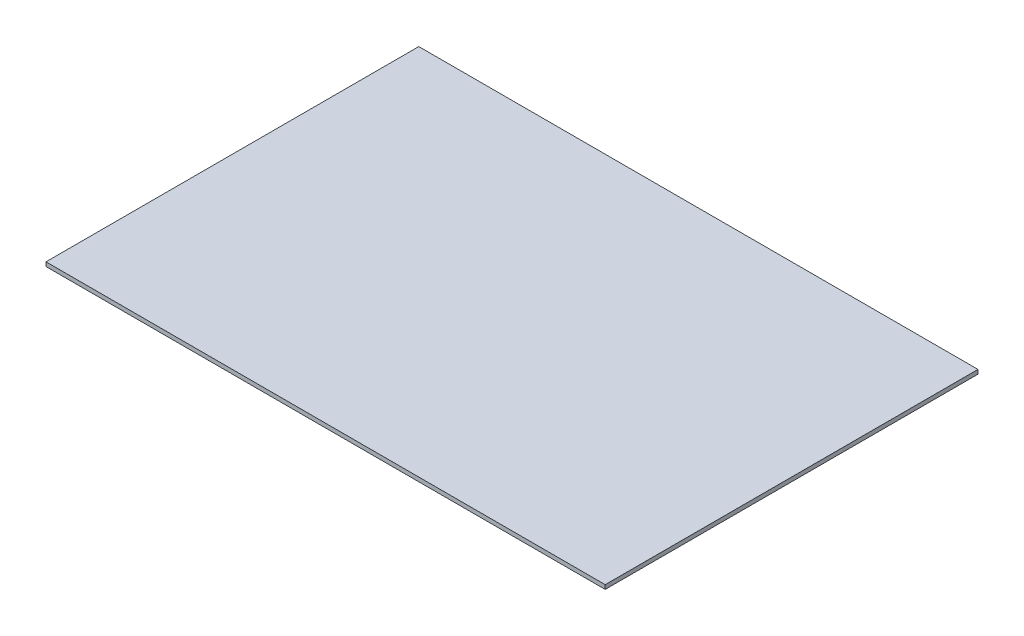
ISO-10303-21;
HEADER;
FILE_DESCRIPTION(('STEP AP214'),'2;1');
FILE_NAME('part.step','',(''),(''),'','','');
FILE_SCHEMA(('AUTOMOTIVE_DESIGN { 1 0 10303 214 1 1 1 1 }'));
ENDSEC;
DATA;
#1=APPLICATION_CONTEXT('core data for automotive mechanical design processes');
#2=APPLICATION_PROTOCOL_DEFINITION('international standard','automotive_design',2000,#1);
#3=PRODUCT_CONTEXT('',#1,'mechanical');
#4=PRODUCT('Part','Part','',(#3));
#5=PRODUCT_RELATED_PRODUCT_CATEGORY('part','',(#4));
#6=PRODUCT_DEFINITION_FORMATION('','',#4);
#7=PRODUCT_DEFINITION_CONTEXT('part definition',#1,'design');
#8=PRODUCT_DEFINITION('design','',#6,#7);
#9=PRODUCT_DEFINITION_SHAPE('','',#8);
#10=(LENGTH_UNIT() NAMED_UNIT(*) SI_UNIT(.MILLI.,.METRE.));
#11=(NAMED_UNIT(*) PLANE_ANGLE_UNIT() SI_UNIT($,.RADIAN.));
#12=(NAMED_UNIT(*) SI_UNIT($,.STERADIAN.) SOLID_ANGLE_UNIT());
#13=UNCERTAINTY_MEASURE_WITH_UNIT(LENGTH_MEASURE(1.E-05),#10,'distance_accuracy_value','');
#14=(GEOMETRIC_REPRESENTATION_CONTEXT(3) GLOBAL_UNCERTAINTY_ASSIGNED_CONTEXT((#13)) GLOBAL_UNIT_ASSIGNED_CONTEXT((#10,
#11,#12)) REPRESENTATION_CONTEXT('',''));
#15=CARTESIAN_POINT('',(0.,0.,0.));
#16=DIRECTION('',(0.,0.,1.));
#17=DIRECTION('',(1.,0.,0.));
#18=AXIS2_PLACEMENT_3D('',#15,#16,#17);
#19=CARTESIAN_POINT('',(3000.,-0.01,2000.01));
#20=DIRECTION('',(1.,0.,0.));
#21=DIRECTION('',(0.,0.,-1.));
#22=AXIS2_PLACEMENT_3D('',#19,#20,#21);
#23=PLANE('',#22);
#24=DIRECTION('',(0.,0.,-1.));
#25=VECTOR('',#24,1.);
#26=CARTESIAN_POINT('',(3000.,22.,1000.));
#27=LINE('',#26,#25);
#28=CARTESIAN_POINT('',(3000.,22.,2000.));
#29=VERTEX_POINT('',#28);
#30=CARTESIAN_POINT('',(3000.,22.,0.));
#31=VERTEX_POINT('',#30);
#32=EDGE_CURVE('P0_E68',#29,#31,#27,.T.);
#33=ORIENTED_EDGE('',*,*,#32,.F.);
#34=DIRECTION('',(0.,1.,0.));
#35=VECTOR('',#34,1.);
#36=CARTESIAN_POINT('',(3000.,11.,2000.));
#37=LINE('',#36,#35);
#38=CARTESIAN_POINT('',(3000.,0.,2000.));
#39=VERTEX_POINT('',#38);
#40=EDGE_CURVE('P0_E55',#39,#29,#37,.T.);
#41=ORIENTED_EDGE('',*,*,#40,.F.);
#42=DIRECTION('',(0.,0.,1.));
#43=VECTOR('',#42,1.);
#44=CARTESIAN_POINT('',(3000.,0.,1000.));
#45=LINE('',#44,#43);
#46=CARTESIAN_POINT('',(3000.,0.,-1.7713216520453E-13));
#47=VERTEX_POINT('',#46);
#48=EDGE_CURVE('P0_E20',#47,#39,#45,.T.);
#49=ORIENTED_EDGE('',*,*,#48,.F.);
#50=DIRECTION('',(0.,-1.,0.));
#51=VECTOR('',#50,1.);
#52=CARTESIAN_POINT('',(3000.,11.,0.));
#53=LINE('',#52,#51);
#54=EDGE_CURVE('P0_E81',#31,#47,#53,.T.);
#55=ORIENTED_EDGE('',*,*,#54,.F.);
#56=EDGE_LOOP('',(#33,#41,#49,#55));
#57=FACE_BOUND('',#56,.T.);
#58=ADVANCED_FACE('P0_F16',(#57),#23,.T.);
#59=CARTESIAN_POINT('',(3000.01,0.,2000.01));
#60=DIRECTION('',(0.,-1.,0.));
#61=DIRECTION('',(-1.,0.,0.));
#62=AXIS2_PLACEMENT_3D('',#59,#60,#61);
#63=PLANE('',#62);
#64=DIRECTION('',(-1.,0.,0.));
#65=VECTOR('',#64,1.);
#66=CARTESIAN_POINT('',(1500.,0.,0.));
#67=LINE('',#66,#65);
#68=CARTESIAN_POINT('',(-3.20824528442644E-13,0.,-1.64347685173384E-13));
#69=VERTEX_POINT('',#68);
#70=EDGE_CURVE('P0_E64',#47,#69,#67,.T.);
#71=ORIENTED_EDGE('',*,*,#70,.F.);
#72=ORIENTED_EDGE('',*,*,#48,.T.);
#73=DIRECTION('',(1.,0.,0.));
#74=VECTOR('',#73,1.);
#75=CARTESIAN_POINT('',(1500.,0.,2000.));
#76=LINE('',#75,#74);
#77=CARTESIAN_POINT('',(-2.74571447324875E-13,0.,2000.));
#78=VERTEX_POINT('',#77);
#79=EDGE_CURVE('P0_E61',#78,#39,#76,.T.);
#80=ORIENTED_EDGE('',*,*,#79,.F.);
#81=DIRECTION('',(0.,0.,1.));
#82=VECTOR('',#81,1.);
#83=CARTESIAN_POINT('',(0.,0.,1000.));
#84=LINE('',#83,#82);
#85=EDGE_CURVE('P0_E83',#69,#78,#84,.T.);
#86=ORIENTED_EDGE('',*,*,#85,.F.);
#87=EDGE_LOOP('',(#71,#72,#80,#86));
#88=FACE_BOUND('',#87,.T.);
#89=ADVANCED_FACE('P0_F60',(#88),#63,.T.);
#90=CARTESIAN_POINT('',(-0.01,-0.01,2000.));
#91=DIRECTION('',(0.,0.,1.));
#92=DIRECTION('',(1.,0.,0.));
#93=AXIS2_PLACEMENT_3D('',#90,#91,#92);
#94=PLANE('',#93);
#95=DIRECTION('',(1.,0.,0.));
#96=VECTOR('',#95,1.);
#97=CARTESIAN_POINT('',(1500.,22.,2000.));
#98=LINE('',#97,#96);
#99=CARTESIAN_POINT('',(-1.11017008506595E-13,22.,2000.));
#100=VERTEX_POINT('',#99);
#101=EDGE_CURVE('P0_E70',#100,#29,#98,.T.);
#102=ORIENTED_EDGE('',*,*,#101,.F.);
#103=DIRECTION('',(0.,1.,0.));
#104=VECTOR('',#103,1.);
#105=CARTESIAN_POINT('',(0.,11.,2000.));
#106=LINE('',#105,#104);
#107=EDGE_CURVE('P0_E74',#78,#100,#106,.T.);
#108=ORIENTED_EDGE('',*,*,#107,.F.);
#109=ORIENTED_EDGE('',*,*,#79,.T.);
#110=ORIENTED_EDGE('',*,*,#40,.T.);
#111=EDGE_LOOP('',(#102,#108,#109,#110));
#112=FACE_BOUND('',#111,.T.);
#113=ADVANCED_FACE('P0_F72',(#112),#94,.T.);
#114=CARTESIAN_POINT('',(-0.0100000000000477,22.,-0.0100000000000477));
#115=DIRECTION('',(0.,1.,0.));
#116=DIRECTION('',(0.,0.,1.));
#117=AXIS2_PLACEMENT_3D('',#114,#115,#116);
#118=PLANE('',#117);
#119=DIRECTION('',(1.,0.,0.));
#120=VECTOR('',#119,1.);
#121=CARTESIAN_POINT('',(1500.,22.,0.));
#122=LINE('',#121,#120);
#123=CARTESIAN_POINT('',(0.,22.,0.));
#124=VERTEX_POINT('',#123);
#125=EDGE_CURVE('P0_E35',#124,#31,#122,.T.);
#126=ORIENTED_EDGE('',*,*,#125,.F.);
#127=DIRECTION('',(0.,0.,-1.));
#128=VECTOR('',#127,1.);
#129=CARTESIAN_POINT('',(0.,22.,1000.));
#130=LINE('',#129,#128);
#131=EDGE_CURVE('P0_E26',#100,#124,#130,.T.);
#132=ORIENTED_EDGE('',*,*,#131,.F.);
#133=ORIENTED_EDGE('',*,*,#101,.T.);
#134=ORIENTED_EDGE('',*,*,#32,.T.);
#135=EDGE_LOOP('',(#126,#132,#133,#134));
#136=FACE_BOUND('',#135,.T.);
#137=ADVANCED_FACE('P0_F88',(#136),#118,.T.);
#138=CARTESIAN_POINT('',(3000.01,-0.01,0.));
#139=DIRECTION('',(0.,0.,-1.));
#140=DIRECTION('',(-1.,0.,0.));
#141=AXIS2_PLACEMENT_3D('',#138,#139,#140);
#142=PLANE('',#141);
#143=ORIENTED_EDGE('',*,*,#125,.T.);
#144=ORIENTED_EDGE('',*,*,#54,.T.);
#145=ORIENTED_EDGE('',*,*,#70,.T.);
#146=DIRECTION('',(0.,-1.,0.));
#147=VECTOR('',#146,1.);
#148=CARTESIAN_POINT('',(0.,11.,0.));
#149=LINE('',#148,#147);
#150=EDGE_CURVE('P0_E11',#124,#69,#149,.T.);
#151=ORIENTED_EDGE('',*,*,#150,.F.);
#152=EDGE_LOOP('',(#143,#144,#145,#151));
#153=FACE_BOUND('',#152,.T.);
#154=ADVANCED_FACE('P0_F90',(#153),#142,.T.);
#155=CARTESIAN_POINT('',(0.,-0.01,-0.01));
#156=DIRECTION('',(-1.,0.,0.));
#157=DIRECTION('',(0.,0.,1.));
#158=AXIS2_PLACEMENT_3D('',#155,#156,#157);
#159=PLANE('',#158);
#160=ORIENTED_EDGE('',*,*,#131,.T.);
#161=ORIENTED_EDGE('',*,*,#150,.T.);
#162=ORIENTED_EDGE('',*,*,#85,.T.);
#163=ORIENTED_EDGE('',*,*,#107,.T.);
#164=EDGE_LOOP('',(#160,#161,#162,#163));
#165=FACE_BOUND('',#164,.T.);
#166=ADVANCED_FACE('P0_F18',(#165),#159,.T.);
#167=CLOSED_SHELL('',(#58,#89,#113,#137,#154,#166));
#168=MANIFOLD_SOLID_BREP('P0_B1',#167);
#169=CARTESIAN_POINT('',(-0.01,21.99,2000.));
#170=DIRECTION('',(0.,0.,1.));
#171=DIRECTION('',(1.,0.,0.));
#172=AXIS2_PLACEMENT_3D('',#169,#170,#171);
#173=PLANE('',#172);
#174=DIRECTION('',(1.,0.,0.));
#175=VECTOR('',#174,1.);
#176=CARTESIAN_POINT('',(1500.,22.2,2000.));
#177=LINE('',#176,#175);
#178=CARTESIAN_POINT('',(0.,22.2,2000.));
#179=VERTEX_POINT('',#178);
#180=CARTESIAN_POINT('',(3000.,22.2,2000.));
#181=VERTEX_POINT('',#180);
#182=EDGE_CURVE('P1_E77',#179,#181,#177,.T.);
#183=ORIENTED_EDGE('',*,*,#182,.F.);
#184=DIRECTION('',(0.,-1.,0.));
#185=VECTOR('',#184,1.);
#186=CARTESIAN_POINT('',(0.,22.1,2000.));
#187=LINE('',#186,#185);
#188=CARTESIAN_POINT('',(0.,22.,2000.));
#189=VERTEX_POINT('',#188);
#190=EDGE_CURVE('P1_E21',#179,#189,#187,.T.);
#191=ORIENTED_EDGE('',*,*,#190,.T.);
#192=DIRECTION('',(-1.,0.,0.));
#193=VECTOR('',#192,1.);
#194=CARTESIAN_POINT('',(1500.,22.,2000.));
#195=LINE('',#194,#193);
#196=CARTESIAN_POINT('',(3000.,22.,2000.));
#197=VERTEX_POINT('',#196);
#198=EDGE_CURVE('P1_E58',#197,#189,#195,.T.);
#199=ORIENTED_EDGE('',*,*,#198,.F.);
#200=DIRECTION('',(0.,-1.,0.));
#201=VECTOR('',#200,1.);
#202=CARTESIAN_POINT('',(3000.,22.1,2000.));
#203=LINE('',#202,#201);
#204=EDGE_CURVE('P1_E61',#181,#197,#203,.T.);
#205=ORIENTED_EDGE('',*,*,#204,.F.);
#206=EDGE_LOOP('',(#183,#191,#199,#205));
#207=FACE_BOUND('',#206,.T.);
#208=ADVANCED_FACE('P1_F17',(#207),#173,.T.);
#209=CARTESIAN_POINT('',(3000.,21.99,2000.01));
#210=DIRECTION('',(1.,0.,0.));
#211=DIRECTION('',(0.,0.,-1.));
#212=AXIS2_PLACEMENT_3D('',#209,#210,#211);
#213=PLANE('',#212);
#214=DIRECTION('',(0.,0.,-1.));
#215=VECTOR('',#214,1.);
#216=CARTESIAN_POINT('',(3000.,22.2,1000.));
#217=LINE('',#216,#215);
#218=CARTESIAN_POINT('',(3000.,22.2,0.));
#219=VERTEX_POINT('',#218);
#220=EDGE_CURVE('P1_E74',#181,#219,#217,.T.);
#221=ORIENTED_EDGE('',*,*,#220,.F.);
#222=ORIENTED_EDGE('',*,*,#204,.T.);
#223=DIRECTION('',(0.,0.,1.));
#224=VECTOR('',#223,1.);
#225=CARTESIAN_POINT('',(3000.,22.,1000.));
#226=LINE('',#225,#224);
#227=CARTESIAN_POINT('',(3000.,22.,0.));
#228=VERTEX_POINT('',#227);
#229=EDGE_CURVE('P1_E71',#228,#197,#226,.T.);
#230=ORIENTED_EDGE('',*,*,#229,.F.);
#231=DIRECTION('',(0.,-1.,0.));
#232=VECTOR('',#231,1.);
#233=CARTESIAN_POINT('',(3000.,22.1,0.));
#234=LINE('',#233,#232);
#235=EDGE_CURVE('P1_E53',#219,#228,#234,.T.);
#236=ORIENTED_EDGE('',*,*,#235,.F.);
#237=EDGE_LOOP('',(#221,#222,#230,#236));
#238=FACE_BOUND('',#237,.T.);
#239=ADVANCED_FACE('P1_F70',(#238),#213,.T.);
#240=CARTESIAN_POINT('',(3000.01,21.99,0.));
#241=DIRECTION('',(0.,0.,-1.));
#242=DIRECTION('',(-1.,0.,0.));
#243=AXIS2_PLACEMENT_3D('',#240,#241,#242);
#244=PLANE('',#243);
#245=DIRECTION('',(-1.,0.,0.));
#246=VECTOR('',#245,1.);
#247=CARTESIAN_POINT('',(1500.,22.2,0.));
#248=LINE('',#247,#246);
#249=CARTESIAN_POINT('',(0.,22.2,0.));
#250=VERTEX_POINT('',#249);
#251=EDGE_CURVE('P1_E85',#219,#250,#248,.T.);
#252=ORIENTED_EDGE('',*,*,#251,.F.);
#253=ORIENTED_EDGE('',*,*,#235,.T.);
#254=DIRECTION('',(1.,0.,0.));
#255=VECTOR('',#254,1.);
#256=CARTESIAN_POINT('',(1500.,22.,-3.24323833305988E-13));
#257=LINE('',#256,#255);
#258=CARTESIAN_POINT('',(0.,22.,0.));
#259=VERTEX_POINT('',#258);
#260=EDGE_CURVE('P1_E67',#259,#228,#257,.T.);
#261=ORIENTED_EDGE('',*,*,#260,.F.);
#262=DIRECTION('',(0.,1.,0.));
#263=VECTOR('',#262,1.);
#264=CARTESIAN_POINT('',(-1.4798173808301E-13,22.1,0.));
#265=LINE('',#264,#263);
#266=EDGE_CURVE('P1_E36',#259,#250,#265,.T.);
#267=ORIENTED_EDGE('',*,*,#266,.T.);
#268=EDGE_LOOP('',(#252,#253,#261,#267));
#269=FACE_BOUND('',#268,.T.);
#270=ADVANCED_FACE('P1_F89',(#269),#244,.T.);
#271=CARTESIAN_POINT('',(-0.0100000000000477,22.,2000.01));
#272=DIRECTION('',(0.,-1.,0.));
#273=DIRECTION('',(0.,0.,-1.));
#274=AXIS2_PLACEMENT_3D('',#271,#272,#273);
#275=PLANE('',#274);
#276=ORIENTED_EDGE('',*,*,#260,.T.);
#277=ORIENTED_EDGE('',*,*,#229,.T.);
#278=ORIENTED_EDGE('',*,*,#198,.T.);
#279=DIRECTION('',(0.,0.,1.));
#280=VECTOR('',#279,1.);
#281=CARTESIAN_POINT('',(0.,22.,1000.));
#282=LINE('',#281,#280);
#283=EDGE_CURVE('P1_E27',#259,#189,#282,.T.);
#284=ORIENTED_EDGE('',*,*,#283,.F.);
#285=EDGE_LOOP('',(#276,#277,#278,#284));
#286=FACE_BOUND('',#285,.T.);
#287=ADVANCED_FACE('P1_F76',(#286),#275,.T.);
#288=CARTESIAN_POINT('',(-0.0100000000000477,22.2,-0.0100000000000477));
#289=DIRECTION('',(0.,1.,0.));
#290=DIRECTION('',(0.,0.,1.));
#291=AXIS2_PLACEMENT_3D('',#288,#289,#290);
#292=PLANE('',#291);
#293=ORIENTED_EDGE('',*,*,#251,.T.);
#294=DIRECTION('',(0.,0.,-1.));
#295=VECTOR('',#294,1.);
#296=CARTESIAN_POINT('',(0.,22.2,1000.));
#297=LINE('',#296,#295);
#298=EDGE_CURVE('P1_E11',#179,#250,#297,.T.);
#299=ORIENTED_EDGE('',*,*,#298,.F.);
#300=ORIENTED_EDGE('',*,*,#182,.T.);
#301=ORIENTED_EDGE('',*,*,#220,.T.);
#302=EDGE_LOOP('',(#293,#299,#300,#301));
#303=FACE_BOUND('',#302,.T.);
#304=ADVANCED_FACE('P1_F97',(#303),#292,.T.);
#305=CARTESIAN_POINT('',(0.,21.99,-0.01));
#306=DIRECTION('',(-1.,0.,0.));
#307=DIRECTION('',(0.,0.,1.));
#308=AXIS2_PLACEMENT_3D('',#305,#306,#307);
#309=PLANE('',#308);
#310=ORIENTED_EDGE('',*,*,#298,.T.);
#311=ORIENTED_EDGE('',*,*,#266,.F.);
#312=ORIENTED_EDGE('',*,*,#283,.T.);
#313=ORIENTED_EDGE('',*,*,#190,.F.);
#314=EDGE_LOOP('',(#310,#311,#312,#313));
#315=FACE_BOUND('',#314,.T.);
#316=ADVANCED_FACE('P1_F19',(#315),#309,.T.);
#317=CLOSED_SHELL('',(#208,#239,#270,#287,#304,#316));
#318=MANIFOLD_SOLID_BREP('P1_B1',#317);
#319=ADVANCED_BREP_SHAPE_REPRESENTATION('',(#18,#168,#318),#14);
#320=SHAPE_DEFINITION_REPRESENTATION(#9,#319);
ENDSEC;
END-ISO-10303-21;
